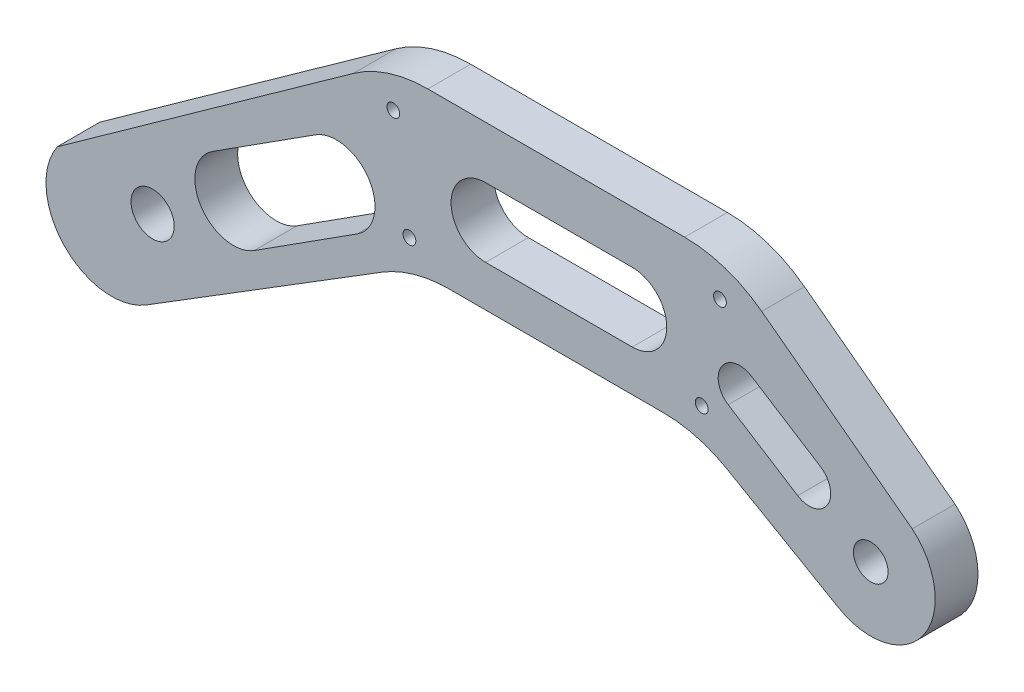
ISO-10303-21;
HEADER;
FILE_DESCRIPTION(('STEP AP214'),'2;1');
FILE_NAME('part.step','',(''),(''),'','','');
FILE_SCHEMA(('AUTOMOTIVE_DESIGN { 1 0 10303 214 1 1 1 1 }'));
ENDSEC;
DATA;
#1=APPLICATION_CONTEXT('core data for automotive mechanical design processes');
#2=APPLICATION_PROTOCOL_DEFINITION('international standard','automotive_design',2000,#1);
#3=PRODUCT_CONTEXT('',#1,'mechanical');
#4=PRODUCT('Part','Part','',(#3));
#5=PRODUCT_RELATED_PRODUCT_CATEGORY('part','',(#4));
#6=PRODUCT_DEFINITION_FORMATION('','',#4);
#7=PRODUCT_DEFINITION_CONTEXT('part definition',#1,'design');
#8=PRODUCT_DEFINITION('design','',#6,#7);
#9=PRODUCT_DEFINITION_SHAPE('','',#8);
#10=(LENGTH_UNIT() NAMED_UNIT(*) SI_UNIT(.MILLI.,.METRE.));
#11=(NAMED_UNIT(*) PLANE_ANGLE_UNIT() SI_UNIT($,.RADIAN.));
#12=(NAMED_UNIT(*) SI_UNIT($,.STERADIAN.) SOLID_ANGLE_UNIT());
#13=UNCERTAINTY_MEASURE_WITH_UNIT(LENGTH_MEASURE(1.E-05),#10,'distance_accuracy_value','');
#14=(GEOMETRIC_REPRESENTATION_CONTEXT(3) GLOBAL_UNCERTAINTY_ASSIGNED_CONTEXT((#13)) GLOBAL_UNIT_ASSIGNED_CONTEXT((#10,
#11,#12)) REPRESENTATION_CONTEXT('',''));
#15=CARTESIAN_POINT('',(0.,0.,0.));
#16=DIRECTION('',(0.,0.,1.));
#17=DIRECTION('',(1.,0.,0.));
#18=AXIS2_PLACEMENT_3D('',#15,#16,#17);
#19=CARTESIAN_POINT('',(66.9996322496604,-5.97090888332281,10.));
#20=DIRECTION('',(0.,0.,1.));
#21=DIRECTION('',(1.,0.,0.));
#22=AXIS2_PLACEMENT_3D('',#19,#20,#21);
#23=PLANE('',#22);
#24=DIRECTION('',(0.844639221607712,-0.535335955566146,0.));
#25=VECTOR('',#24,1.);
#26=CARTESIAN_POINT('',(33.6819304769976,9.18898153360824,10.));
#27=LINE('',#26,#25);
#28=CARTESIAN_POINT('',(33.6819304769976,9.18898153360824,10.));
#29=VERTEX_POINT('',#28);
#30=CARTESIAN_POINT('',(49.9150927269323,-1.09966621399208,10.));
#31=VERTEX_POINT('',#30);
#32=EDGE_CURVE('E202',#29,#31,#27,.T.);
#33=ORIENTED_EDGE('',*,*,#32,.F.);
#34=CARTESIAN_POINT('',(36.3754870818161,13.4388054626663,10.));
#35=DIRECTION('',(0.,0.,1.));
#36=DIRECTION('',(1.,0.,0.));
#37=AXIS2_PLACEMENT_3D('',#34,#35,#36);
#38=CIRCLE('',#37,5.03152567432146);
#39=CARTESIAN_POINT('',(39.0690436866346,17.6886293917244,10.));
#40=VERTEX_POINT('',#39);
#41=EDGE_CURVE('E194',#40,#29,#38,.T.);
#42=ORIENTED_EDGE('',*,*,#41,.F.);
#43=DIRECTION('',(-0.844639221607712,0.535335955566146,0.));
#44=VECTOR('',#43,1.);
#45=CARTESIAN_POINT('',(39.0690436866346,17.6886293917244,10.));
#46=LINE('',#45,#44);
#47=CARTESIAN_POINT('',(55.3022059365693,7.39998164412411,10.));
#48=VERTEX_POINT('',#47);
#49=EDGE_CURVE('E217',#48,#40,#46,.T.);
#50=ORIENTED_EDGE('',*,*,#49,.F.);
#51=CARTESIAN_POINT('',(52.6086493317508,3.15015771506601,10.));
#52=DIRECTION('',(0.,0.,1.));
#53=DIRECTION('',(1.,0.,0.));
#54=AXIS2_PLACEMENT_3D('',#51,#52,#53);
#55=CIRCLE('',#54,5.03152567432146);
#56=EDGE_CURVE('E215',#31,#48,#55,.T.);
#57=ORIENTED_EDGE('',*,*,#56,.F.);
#58=EDGE_LOOP('',(#33,#42,#50,#57));
#59=FACE_BOUND('',#58,.T.);
#60=DIRECTION('',(0.999999993836885,0.000111023552924919,0.));
#61=VECTOR('',#60,1.);
#62=CARTESIAN_POINT('',(-23.0148774643984,9.64579089430955,10.));
#63=LINE('',#62,#61);
#64=CARTESIAN_POINT('',(-23.0148774643984,9.64579089430955,10.));
#65=VERTEX_POINT('',#64);
#66=CARTESIAN_POINT('',(11.2525318644533,9.64959538386622,10.));
#67=VERTEX_POINT('',#66);
#68=EDGE_CURVE('E235',#65,#67,#63,.T.);
#69=ORIENTED_EDGE('',*,*,#68,.F.);
#70=CARTESIAN_POINT('',(-23.0157729525845,17.7115405214186,10.));
#71=DIRECTION('',(0.,0.,1.));
#72=DIRECTION('',(1.,0.,0.));
#73=AXIS2_PLACEMENT_3D('',#70,#71,#72);
#74=CIRCLE('',#73,8.06574967681922);
#75=CARTESIAN_POINT('',(-23.0166684407707,25.7772901485277,10.));
#76=VERTEX_POINT('',#75);
#77=EDGE_CURVE('E233',#76,#65,#74,.T.);
#78=ORIENTED_EDGE('',*,*,#77,.F.);
#79=DIRECTION('',(-0.999999993836885,-0.000111023552924919,0.));
#80=VECTOR('',#79,1.);
#81=CARTESIAN_POINT('',(-23.0166684407707,25.7772901485277,10.));
#82=LINE('',#81,#80);
#83=CARTESIAN_POINT('',(11.2507408880811,25.7810946380844,10.));
#84=VERTEX_POINT('',#83);
#85=EDGE_CURVE('E241',#84,#76,#82,.T.);
#86=ORIENTED_EDGE('',*,*,#85,.F.);
#87=CARTESIAN_POINT('',(11.2516363762672,17.7153450109753,10.));
#88=DIRECTION('',(0.,0.,1.));
#89=DIRECTION('',(1.,0.,0.));
#90=AXIS2_PLACEMENT_3D('',#87,#88,#89);
#91=CIRCLE('',#90,8.06574967681922);
#92=EDGE_CURVE('E238',#67,#84,#91,.T.);
#93=ORIENTED_EDGE('',*,*,#92,.F.);
#94=EDGE_LOOP('',(#69,#78,#86,#93));
#95=FACE_BOUND('',#94,.T.);
#96=CARTESIAN_POINT('',(27.4947716003729,5.86799341932424,10.));
#97=DIRECTION('',(0.,0.,1.));
#98=DIRECTION('',(1.,0.,0.));
#99=AXIS2_PLACEMENT_3D('',#96,#97,#98);
#100=CIRCLE('',#99,1.5);
#101=CARTESIAN_POINT('',(28.9947716003729,5.86799341932424,10.));
#102=VERTEX_POINT('',#101);
#103=EDGE_CURVE('E264',#102,#102,#100,.T.);
#104=ORIENTED_EDGE('',*,*,#103,.F.);
#105=EDGE_LOOP('',(#104));
#106=FACE_BOUND('',#105,.T.);
#107=CARTESIAN_POINT('',(-40.8181037870652,5.76558338358292,10.));
#108=DIRECTION('',(0.,0.,1.));
#109=DIRECTION('',(1.,0.,0.));
#110=AXIS2_PLACEMENT_3D('',#107,#108,#109);
#111=CIRCLE('',#110,1.49999999999998);
#112=CARTESIAN_POINT('',(-39.3181037870652,5.76558338358292,10.));
#113=VERTEX_POINT('',#112);
#114=EDGE_CURVE('E276',#113,#113,#111,.T.);
#115=ORIENTED_EDGE('',*,*,#114,.F.);
#116=EDGE_LOOP('',(#115));
#117=FACE_BOUND('',#116,.T.);
#118=CARTESIAN_POINT('',(66.9996322496604,-5.97090888332281,10.));
#119=DIRECTION('',(0.,0.,1.));
#120=DIRECTION('',(1.,0.,0.));
#121=AXIS2_PLACEMENT_3D('',#118,#119,#120);
#122=CIRCLE('',#121,4.05);
#123=CARTESIAN_POINT('',(71.0496322496604,-5.97090888332281,10.));
#124=VERTEX_POINT('',#123);
#125=EDGE_CURVE('E319',#124,#124,#122,.T.);
#126=ORIENTED_EDGE('',*,*,#125,.F.);
#127=EDGE_LOOP('',(#126));
#128=FACE_BOUND('',#127,.T.);
#129=CARTESIAN_POINT('',(66.9996322496604,-5.97090888332281,10.));
#130=DIRECTION('',(0.,0.,1.));
#131=DIRECTION('',(1.,0.,0.));
#132=AXIS2_PLACEMENT_3D('',#129,#130,#131);
#133=CIRCLE('',#132,15.0575187120752);
#134=CARTESIAN_POINT('',(59.4730599936473,-19.0123650842042,10.));
#135=VERTEX_POINT('',#134);
#136=CARTESIAN_POINT('',(76.6803530841787,5.56219624446554,10.));
#137=VERTEX_POINT('',#136);
#138=EDGE_CURVE('E325',#135,#137,#133,.T.);
#139=ORIENTED_EDGE('',*,*,#138,.T.);
#140=DIRECTION('',(-0.799474468914619,0.60070006954693,0.));
#141=VECTOR('',#140,1.);
#142=CARTESIAN_POINT('',(41.5151421460553,31.9842340674384,10.));
#143=LINE('',#142,#141);
#144=CARTESIAN_POINT('',(41.5151421460553,31.9842340674384,10.));
#145=VERTEX_POINT('',#144);
#146=EDGE_CURVE('E328',#137,#145,#143,.T.);
#147=ORIENTED_EDGE('',*,*,#146,.T.);
#148=CARTESIAN_POINT('',(23.4941400596474,7.9999999999998,10.));
#149=DIRECTION('',(0.,0.,1.));
#150=DIRECTION('',(1.,0.,0.));
#151=AXIS2_PLACEMENT_3D('',#148,#149,#150);
#152=CIRCLE('',#151,30.);
#153=CARTESIAN_POINT('',(23.4941400596474,37.9999999999998,10.));
#154=VERTEX_POINT('',#153);
#155=EDGE_CURVE('E331',#145,#154,#152,.T.);
#156=ORIENTED_EDGE('',*,*,#155,.T.);
#157=DIRECTION('',(-1.,0.,0.));
#158=VECTOR('',#157,1.);
#159=CARTESIAN_POINT('',(-36.5058599403526,37.9999999999999,10.));
#160=LINE('',#159,#158);
#161=CARTESIAN_POINT('',(-36.5058599403526,37.9999999999999,10.));
#162=VERTEX_POINT('',#161);
#163=EDGE_CURVE('E333',#154,#162,#160,.T.);
#164=ORIENTED_EDGE('',*,*,#163,.T.);
#165=CARTESIAN_POINT('',(-36.5058599403526,7.99999999999989,10.));
#166=DIRECTION('',(0.,0.,1.));
#167=DIRECTION('',(1.,0.,0.));
#168=AXIS2_PLACEMENT_3D('',#165,#166,#167);
#169=CIRCLE('',#168,30.);
#170=CARTESIAN_POINT('',(-53.9471297978905,32.4090578629437,10.));
#171=VERTEX_POINT('',#170);
#172=EDGE_CURVE('E335',#162,#171,#169,.T.);
#173=ORIENTED_EDGE('',*,*,#172,.T.);
#174=DIRECTION('',(-0.813635262098129,-0.581375661917929,0.));
#175=VECTOR('',#174,1.);
#176=CARTESIAN_POINT('',(-53.9471297978905,32.4090578629437,10.));
#177=LINE('',#176,#175);
#178=CARTESIAN_POINT('',(-123.106127076231,-17.0078734000802,10.));
#179=VERTEX_POINT('',#178);
#180=EDGE_CURVE('E337',#171,#179,#177,.T.);
#181=ORIENTED_EDGE('',*,*,#180,.T.);
#182=CARTESIAN_POINT('',(-110.402654210412,-25.6027206988543,10.));
#183=DIRECTION('',(0.,0.,1.));
#184=DIRECTION('',(-1.,0.,0.));
#185=AXIS2_PLACEMENT_3D('',#182,#183,#184);
#186=CIRCLE('',#185,15.3378493584286);
#187=CARTESIAN_POINT('',(-102.315148598159,-38.6350603166524,10.));
#188=VERTEX_POINT('',#187);
#189=EDGE_CURVE('E339',#179,#188,#186,.T.);
#190=ORIENTED_EDGE('',*,*,#189,.T.);
#191=DIRECTION('',(0.849684940388097,0.527290718747899,0.));
#192=VECTOR('',#191,1.);
#193=CARTESIAN_POINT('',(-47.3245815027895,-4.50945178835709,10.));
#194=LINE('',#193,#192);
#195=CARTESIAN_POINT('',(-47.3245815027895,-4.50945178835709,10.));
#196=VERTEX_POINT('',#195);
#197=EDGE_CURVE('E341',#188,#196,#194,.T.);
#198=ORIENTED_EDGE('',*,*,#197,.T.);
#199=CARTESIAN_POINT('',(-31.5058599403526,-30.,10.));
#200=DIRECTION('',(0.,0.,-1.));
#201=DIRECTION('',(1.,0.,0.));
#202=AXIS2_PLACEMENT_3D('',#199,#200,#201);
#203=CIRCLE('',#202,30.);
#204=CARTESIAN_POINT('',(-31.5058599403526,0.,10.));
#205=VERTEX_POINT('',#204);
#206=EDGE_CURVE('E343',#196,#205,#203,.T.);
#207=ORIENTED_EDGE('',*,*,#206,.T.);
#208=DIRECTION('',(1.,0.,0.));
#209=VECTOR('',#208,1.);
#210=CARTESIAN_POINT('',(-31.5058599403526,0.,10.));
#211=LINE('',#210,#209);
#212=CARTESIAN_POINT('',(18.4941400596474,-1.90488925126094E-13,10.));
#213=VERTEX_POINT('',#212);
#214=EDGE_CURVE('E345',#205,#213,#211,.T.);
#215=ORIENTED_EDGE('',*,*,#214,.T.);
#216=CARTESIAN_POINT('',(18.4941400596473,-30.0000000000002,10.));
#217=DIRECTION('',(0.,0.,-1.));
#218=DIRECTION('',(1.,0.,0.));
#219=AXIS2_PLACEMENT_3D('',#216,#217,#218);
#220=CIRCLE('',#219,30.);
#221=CARTESIAN_POINT('',(33.4897825687493,-4.01672257510221,10.));
#222=VERTEX_POINT('',#221);
#223=EDGE_CURVE('E347',#213,#222,#220,.T.);
#224=ORIENTED_EDGE('',*,*,#223,.T.);
#225=DIRECTION('',(0.866109247496599,-0.4998547503034,0.));
#226=VECTOR('',#225,1.);
#227=CARTESIAN_POINT('',(33.4897825687493,-4.01672257510221,10.));
#228=LINE('',#227,#226);
#229=EDGE_CURVE('E349',#222,#135,#228,.T.);
#230=ORIENTED_EDGE('',*,*,#229,.T.);
#231=EDGE_LOOP('',(#139,#147,#156,#164,#173,#181,#190,#198,#207,#215,#224,#230));
#232=FACE_BOUND('',#231,.T.);
#233=CARTESIAN_POINT('',(-44.5758143792834,29.6531275088075,10.));
#234=DIRECTION('',(0.,0.,1.));
#235=DIRECTION('',(1.,0.,0.));
#236=AXIS2_PLACEMENT_3D('',#233,#234,#235);
#237=CIRCLE('',#236,1.50000000000001);
#238=CARTESIAN_POINT('',(-43.0758143792834,29.6531275088075,10.));
#239=VERTEX_POINT('',#238);
#240=EDGE_CURVE('E313',#239,#239,#237,.T.);
#241=ORIENTED_EDGE('',*,*,#240,.F.);
#242=EDGE_LOOP('',(#241));
#243=FACE_BOUND('',#242,.T.);
#244=DIRECTION('',(0.842381925813462,0.538880961867094,0.));
#245=VECTOR('',#244,1.);
#246=CARTESIAN_POINT('',(-77.0725993824998,-14.9887164971939,10.));
#247=LINE('',#246,#245);
#248=CARTESIAN_POINT('',(-77.0725993824998,-14.9887164971939,10.));
#249=VERTEX_POINT('',#248);
#250=CARTESIAN_POINT('',(-53.0140360617953,0.401810467023691,10.));
#251=VERTEX_POINT('',#250);
#252=EDGE_CURVE('E284',#249,#251,#247,.T.);
#253=ORIENTED_EDGE('',*,*,#252,.F.);
#254=CARTESIAN_POINT('',(-81.9332446058939,-7.39052696421769,10.));
#255=DIRECTION('',(0.,0.,1.));
#256=DIRECTION('',(1.,0.,0.));
#257=AXIS2_PLACEMENT_3D('',#254,#255,#256);
#258=CIRCLE('',#257,9.01988670476146);
#259=CARTESIAN_POINT('',(-86.793889829288,0.207662568758501,10.));
#260=VERTEX_POINT('',#259);
#261=EDGE_CURVE('E282',#260,#249,#258,.T.);
#262=ORIENTED_EDGE('',*,*,#261,.F.);
#263=DIRECTION('',(-0.842381925813462,-0.538880961867094,0.));
#264=VECTOR('',#263,1.);
#265=CARTESIAN_POINT('',(-86.793889829288,0.207662568758501,10.));
#266=LINE('',#265,#264);
#267=CARTESIAN_POINT('',(-62.7353265085835,15.5981895329761,10.));
#268=VERTEX_POINT('',#267);
#269=EDGE_CURVE('E290',#268,#260,#266,.T.);
#270=ORIENTED_EDGE('',*,*,#269,.F.);
#271=CARTESIAN_POINT('',(-57.8746812851894,7.99999999999989,10.));
#272=DIRECTION('',(0.,0.,1.));
#273=DIRECTION('',(1.,0.,0.));
#274=AXIS2_PLACEMENT_3D('',#271,#272,#273);
#275=CIRCLE('',#274,9.01988670476146);
#276=EDGE_CURVE('E287',#251,#268,#275,.T.);
#277=ORIENTED_EDGE('',*,*,#276,.F.);
#278=EDGE_LOOP('',(#253,#262,#270,#277));
#279=FACE_BOUND('',#278,.T.);
#280=CARTESIAN_POINT('',(31.7549387550586,29.5667763227115,10.));
#281=DIRECTION('',(0.,0.,1.));
#282=DIRECTION('',(1.,0.,0.));
#283=AXIS2_PLACEMENT_3D('',#280,#281,#282);
#284=CIRCLE('',#283,1.5);
#285=CARTESIAN_POINT('',(33.2549387550586,29.5667763227115,10.));
#286=VERTEX_POINT('',#285);
#287=EDGE_CURVE('E270',#286,#286,#284,.T.);
#288=ORIENTED_EDGE('',*,*,#287,.F.);
#289=EDGE_LOOP('',(#288));
#290=FACE_BOUND('',#289,.T.);
#291=CARTESIAN_POINT('',(-100.821311964303,-19.4734309226343,10.));
#292=DIRECTION('',(0.,0.,1.));
#293=DIRECTION('',(1.,0.,0.));
#294=AXIS2_PLACEMENT_3D('',#291,#292,#293);
#295=CIRCLE('',#294,5.05);
#296=CARTESIAN_POINT('',(-95.7713119643031,-19.4734309226343,10.));
#297=VERTEX_POINT('',#296);
#298=EDGE_CURVE('E223',#297,#297,#295,.T.);
#299=ORIENTED_EDGE('',*,*,#298,.F.);
#300=EDGE_LOOP('',(#299));
#301=FACE_BOUND('',#300,.T.);
#302=ADVANCED_FACE('F33',(#59,#95,#106,#117,#128,#232,#243,#279,#290,#301),#23,.T.);
#303=CARTESIAN_POINT('',(66.9996322496604,-5.97090888332281,0.));
#304=DIRECTION('',(0.,0.,1.));
#305=DIRECTION('',(1.,0.,0.));
#306=AXIS2_PLACEMENT_3D('',#303,#304,#305);
#307=PLANE('',#306);
#308=CARTESIAN_POINT('',(-23.0157729525845,17.7115405214186,0.));
#309=DIRECTION('',(0.,0.,1.));
#310=DIRECTION('',(1.,0.,0.));
#311=AXIS2_PLACEMENT_3D('',#308,#309,#310);
#312=CIRCLE('',#311,8.06574967681922);
#313=CARTESIAN_POINT('',(-23.0166684407707,25.7772901485277,0.));
#314=VERTEX_POINT('',#313);
#315=CARTESIAN_POINT('',(-23.0148774643984,9.64579089430955,0.));
#316=VERTEX_POINT('',#315);
#317=EDGE_CURVE('E210',#314,#316,#312,.T.);
#318=ORIENTED_EDGE('',*,*,#317,.T.);
#319=DIRECTION('',(0.999999993836885,0.000111023552924919,0.));
#320=VECTOR('',#319,1.);
#321=CARTESIAN_POINT('',(-23.0148774643984,9.64579089430955,0.));
#322=LINE('',#321,#320);
#323=CARTESIAN_POINT('',(11.2525318644533,9.64959538386622,0.));
#324=VERTEX_POINT('',#323);
#325=EDGE_CURVE('E246',#316,#324,#322,.T.);
#326=ORIENTED_EDGE('',*,*,#325,.T.);
#327=CARTESIAN_POINT('',(11.2516363762672,17.7153450109753,0.));
#328=DIRECTION('',(0.,0.,1.));
#329=DIRECTION('',(1.,0.,0.));
#330=AXIS2_PLACEMENT_3D('',#327,#328,#329);
#331=CIRCLE('',#330,8.06574967681922);
#332=CARTESIAN_POINT('',(11.2507408880811,25.7810946380844,0.));
#333=VERTEX_POINT('',#332);
#334=EDGE_CURVE('E249',#324,#333,#331,.T.);
#335=ORIENTED_EDGE('',*,*,#334,.T.);
#336=DIRECTION('',(-0.999999993836885,-0.000111023552924919,0.));
#337=VECTOR('',#336,1.);
#338=CARTESIAN_POINT('',(-23.0166684407707,25.7772901485277,0.));
#339=LINE('',#338,#337);
#340=EDGE_CURVE('E236',#333,#314,#339,.T.);
#341=ORIENTED_EDGE('',*,*,#340,.T.);
#342=EDGE_LOOP('',(#318,#326,#335,#341));
#343=FACE_BOUND('',#342,.T.);
#344=CARTESIAN_POINT('',(-44.5758143792834,29.6531275088075,0.));
#345=DIRECTION('',(0.,0.,1.));
#346=DIRECTION('',(1.,0.,0.));
#347=AXIS2_PLACEMENT_3D('',#344,#345,#346);
#348=CIRCLE('',#347,1.50000000000001);
#349=CARTESIAN_POINT('',(-43.0758143792834,29.6531275088075,0.));
#350=VERTEX_POINT('',#349);
#351=EDGE_CURVE('E312',#350,#350,#348,.T.);
#352=ORIENTED_EDGE('',*,*,#351,.T.);
#353=EDGE_LOOP('',(#352));
#354=FACE_BOUND('',#353,.T.);
#355=CARTESIAN_POINT('',(66.9996322496604,-5.97090888332281,0.));
#356=DIRECTION('',(0.,0.,1.));
#357=DIRECTION('',(1.,0.,0.));
#358=AXIS2_PLACEMENT_3D('',#355,#356,#357);
#359=CIRCLE('',#358,4.05);
#360=CARTESIAN_POINT('',(71.0496322496604,-5.97090888332281,0.));
#361=VERTEX_POINT('',#360);
#362=EDGE_CURVE('E316',#361,#361,#359,.T.);
#363=ORIENTED_EDGE('',*,*,#362,.T.);
#364=EDGE_LOOP('',(#363));
#365=FACE_BOUND('',#364,.T.);
#366=CARTESIAN_POINT('',(66.9996322496604,-5.97090888332281,0.));
#367=DIRECTION('',(0.,0.,1.));
#368=DIRECTION('',(1.,0.,0.));
#369=AXIS2_PLACEMENT_3D('',#366,#367,#368);
#370=CIRCLE('',#369,15.0575187120752);
#371=CARTESIAN_POINT('',(59.4730599936473,-19.0123650842042,0.));
#372=VERTEX_POINT('',#371);
#373=CARTESIAN_POINT('',(76.6803530841787,5.56219624446554,0.));
#374=VERTEX_POINT('',#373);
#375=EDGE_CURVE('E322',#372,#374,#370,.T.);
#376=ORIENTED_EDGE('',*,*,#375,.F.);
#377=DIRECTION('',(0.866109247496599,-0.4998547503034,0.));
#378=VECTOR('',#377,1.);
#379=CARTESIAN_POINT('',(33.4897825687493,-4.01672257510221,0.));
#380=LINE('',#379,#378);
#381=CARTESIAN_POINT('',(33.4897825687493,-4.01672257510221,0.));
#382=VERTEX_POINT('',#381);
#383=EDGE_CURVE('E329',#382,#372,#380,.T.);
#384=ORIENTED_EDGE('',*,*,#383,.F.);
#385=CARTESIAN_POINT('',(18.4941400596473,-30.0000000000002,0.));
#386=DIRECTION('',(0.,0.,-1.));
#387=DIRECTION('',(1.,0.,0.));
#388=AXIS2_PLACEMENT_3D('',#385,#386,#387);
#389=CIRCLE('',#388,30.);
#390=CARTESIAN_POINT('',(18.4941400596474,-1.90488925126094E-13,0.));
#391=VERTEX_POINT('',#390);
#392=EDGE_CURVE('E372',#391,#382,#389,.T.);
#393=ORIENTED_EDGE('',*,*,#392,.F.);
#394=DIRECTION('',(1.,0.,0.));
#395=VECTOR('',#394,1.);
#396=CARTESIAN_POINT('',(-31.5058599403526,0.,0.));
#397=LINE('',#396,#395);
#398=CARTESIAN_POINT('',(-31.5058599403526,0.,0.));
#399=VERTEX_POINT('',#398);
#400=EDGE_CURVE('E370',#399,#391,#397,.T.);
#401=ORIENTED_EDGE('',*,*,#400,.F.);
#402=CARTESIAN_POINT('',(-31.5058599403526,-30.,0.));
#403=DIRECTION('',(0.,0.,-1.));
#404=DIRECTION('',(1.,0.,0.));
#405=AXIS2_PLACEMENT_3D('',#402,#403,#404);
#406=CIRCLE('',#405,30.);
#407=CARTESIAN_POINT('',(-47.3245815027895,-4.50945178835709,0.));
#408=VERTEX_POINT('',#407);
#409=EDGE_CURVE('E368',#408,#399,#406,.T.);
#410=ORIENTED_EDGE('',*,*,#409,.F.);
#411=DIRECTION('',(0.849684940388097,0.527290718747899,0.));
#412=VECTOR('',#411,1.);
#413=CARTESIAN_POINT('',(-47.3245815027895,-4.50945178835709,0.));
#414=LINE('',#413,#412);
#415=CARTESIAN_POINT('',(-102.315148598159,-38.6350603166524,0.));
#416=VERTEX_POINT('',#415);
#417=EDGE_CURVE('E366',#416,#408,#414,.T.);
#418=ORIENTED_EDGE('',*,*,#417,.F.);
#419=CARTESIAN_POINT('',(-110.402654210412,-25.6027206988543,0.));
#420=DIRECTION('',(0.,0.,1.));
#421=DIRECTION('',(-1.,0.,0.));
#422=AXIS2_PLACEMENT_3D('',#419,#420,#421);
#423=CIRCLE('',#422,15.3378493584286);
#424=CARTESIAN_POINT('',(-123.106127076231,-17.0078734000802,0.));
#425=VERTEX_POINT('',#424);
#426=EDGE_CURVE('E364',#425,#416,#423,.T.);
#427=ORIENTED_EDGE('',*,*,#426,.F.);
#428=DIRECTION('',(-0.813635262098129,-0.581375661917929,0.));
#429=VECTOR('',#428,1.);
#430=CARTESIAN_POINT('',(-53.9471297978905,32.4090578629437,0.));
#431=LINE('',#430,#429);
#432=CARTESIAN_POINT('',(-53.9471297978905,32.4090578629437,0.));
#433=VERTEX_POINT('',#432);
#434=EDGE_CURVE('E362',#433,#425,#431,.T.);
#435=ORIENTED_EDGE('',*,*,#434,.F.);
#436=CARTESIAN_POINT('',(-36.5058599403526,7.99999999999989,0.));
#437=DIRECTION('',(0.,0.,1.));
#438=DIRECTION('',(1.,0.,0.));
#439=AXIS2_PLACEMENT_3D('',#436,#437,#438);
#440=CIRCLE('',#439,30.);
#441=CARTESIAN_POINT('',(-36.5058599403526,37.9999999999999,0.));
#442=VERTEX_POINT('',#441);
#443=EDGE_CURVE('E360',#442,#433,#440,.T.);
#444=ORIENTED_EDGE('',*,*,#443,.F.);
#445=DIRECTION('',(-1.,0.,0.));
#446=VECTOR('',#445,1.);
#447=CARTESIAN_POINT('',(-36.5058599403526,37.9999999999999,0.));
#448=LINE('',#447,#446);
#449=CARTESIAN_POINT('',(23.4941400596474,37.9999999999998,0.));
#450=VERTEX_POINT('',#449);
#451=EDGE_CURVE('E358',#450,#442,#448,.T.);
#452=ORIENTED_EDGE('',*,*,#451,.F.);
#453=CARTESIAN_POINT('',(23.4941400596474,7.9999999999998,0.));
#454=DIRECTION('',(0.,0.,1.));
#455=DIRECTION('',(1.,0.,0.));
#456=AXIS2_PLACEMENT_3D('',#453,#454,#455);
#457=CIRCLE('',#456,30.);
#458=CARTESIAN_POINT('',(41.5151421460553,31.9842340674384,0.));
#459=VERTEX_POINT('',#458);
#460=EDGE_CURVE('E356',#459,#450,#457,.T.);
#461=ORIENTED_EDGE('',*,*,#460,.F.);
#462=DIRECTION('',(-0.799474468914619,0.60070006954693,0.));
#463=VECTOR('',#462,1.);
#464=CARTESIAN_POINT('',(41.5151421460553,31.9842340674384,0.));
#465=LINE('',#464,#463);
#466=EDGE_CURVE('E354',#374,#459,#465,.T.);
#467=ORIENTED_EDGE('',*,*,#466,.F.);
#468=EDGE_LOOP('',(#376,#384,#393,#401,#410,#418,#427,#435,#444,#452,#461,#467));
#469=FACE_BOUND('',#468,.T.);
#470=CARTESIAN_POINT('',(-81.9332446058939,-7.39052696421769,0.));
#471=DIRECTION('',(0.,0.,1.));
#472=DIRECTION('',(1.,0.,0.));
#473=AXIS2_PLACEMENT_3D('',#470,#471,#472);
#474=CIRCLE('',#473,9.01988670476146);
#475=CARTESIAN_POINT('',(-86.793889829288,0.207662568758496,0.));
#476=VERTEX_POINT('',#475);
#477=CARTESIAN_POINT('',(-77.0725993824998,-14.9887164971939,0.));
#478=VERTEX_POINT('',#477);
#479=EDGE_CURVE('E279',#476,#478,#474,.T.);
#480=ORIENTED_EDGE('',*,*,#479,.T.);
#481=DIRECTION('',(0.842381925813462,0.538880961867094,0.));
#482=VECTOR('',#481,1.);
#483=CARTESIAN_POINT('',(-77.0725993824998,-14.9887164971939,0.));
#484=LINE('',#483,#482);
#485=CARTESIAN_POINT('',(-53.0140360617953,0.401810467023691,0.));
#486=VERTEX_POINT('',#485);
#487=EDGE_CURVE('E295',#478,#486,#484,.T.);
#488=ORIENTED_EDGE('',*,*,#487,.T.);
#489=CARTESIAN_POINT('',(-57.8746812851894,7.99999999999989,0.));
#490=DIRECTION('',(0.,0.,1.));
#491=DIRECTION('',(1.,0.,0.));
#492=AXIS2_PLACEMENT_3D('',#489,#490,#491);
#493=CIRCLE('',#492,9.01988670476146);
#494=CARTESIAN_POINT('',(-62.7353265085835,15.5981895329761,0.));
#495=VERTEX_POINT('',#494);
#496=EDGE_CURVE('E298',#486,#495,#493,.T.);
#497=ORIENTED_EDGE('',*,*,#496,.T.);
#498=DIRECTION('',(-0.842381925813462,-0.538880961867094,0.));
#499=VECTOR('',#498,1.);
#500=CARTESIAN_POINT('',(-86.793889829288,0.207662568758501,0.));
#501=LINE('',#500,#499);
#502=EDGE_CURVE('E285',#495,#476,#501,.T.);
#503=ORIENTED_EDGE('',*,*,#502,.T.);
#504=EDGE_LOOP('',(#480,#488,#497,#503));
#505=FACE_BOUND('',#504,.T.);
#506=CARTESIAN_POINT('',(-40.8181037870652,5.76558338358292,0.));
#507=DIRECTION('',(0.,0.,1.));
#508=DIRECTION('',(1.,0.,0.));
#509=AXIS2_PLACEMENT_3D('',#506,#507,#508);
#510=CIRCLE('',#509,1.49999999999998);
#511=CARTESIAN_POINT('',(-39.3181037870652,5.76558338358292,0.));
#512=VERTEX_POINT('',#511);
#513=EDGE_CURVE('E273',#512,#512,#510,.T.);
#514=ORIENTED_EDGE('',*,*,#513,.T.);
#515=EDGE_LOOP('',(#514));
#516=FACE_BOUND('',#515,.T.);
#517=CARTESIAN_POINT('',(31.7549387550586,29.5667763227115,0.));
#518=DIRECTION('',(0.,0.,1.));
#519=DIRECTION('',(1.,0.,0.));
#520=AXIS2_PLACEMENT_3D('',#517,#518,#519);
#521=CIRCLE('',#520,1.5);
#522=CARTESIAN_POINT('',(33.2549387550586,29.5667763227115,0.));
#523=VERTEX_POINT('',#522);
#524=EDGE_CURVE('E267',#523,#523,#521,.T.);
#525=ORIENTED_EDGE('',*,*,#524,.T.);
#526=EDGE_LOOP('',(#525));
#527=FACE_BOUND('',#526,.T.);
#528=CARTESIAN_POINT('',(27.4947716003729,5.86799341932424,0.));
#529=DIRECTION('',(0.,0.,1.));
#530=DIRECTION('',(1.,0.,0.));
#531=AXIS2_PLACEMENT_3D('',#528,#529,#530);
#532=CIRCLE('',#531,1.5);
#533=CARTESIAN_POINT('',(28.9947716003729,5.86799341932424,0.));
#534=VERTEX_POINT('',#533);
#535=EDGE_CURVE('E263',#534,#534,#532,.T.);
#536=ORIENTED_EDGE('',*,*,#535,.T.);
#537=EDGE_LOOP('',(#536));
#538=FACE_BOUND('',#537,.T.);
#539=CARTESIAN_POINT('',(36.3754870818161,13.4388054626663,0.));
#540=DIRECTION('',(0.,0.,1.));
#541=DIRECTION('',(1.,0.,0.));
#542=AXIS2_PLACEMENT_3D('',#539,#540,#541);
#543=CIRCLE('',#542,5.03152567432146);
#544=CARTESIAN_POINT('',(39.0690436866346,17.6886293917244,0.));
#545=VERTEX_POINT('',#544);
#546=CARTESIAN_POINT('',(33.6819304769976,9.18898153360824,0.));
#547=VERTEX_POINT('',#546);
#548=EDGE_CURVE('E56',#545,#547,#543,.T.);
#549=ORIENTED_EDGE('',*,*,#548,.T.);
#550=DIRECTION('',(0.844639221607712,-0.535335955566146,0.));
#551=VECTOR('',#550,1.);
#552=CARTESIAN_POINT('',(33.6819304769976,9.18898153360824,0.));
#553=LINE('',#552,#551);
#554=CARTESIAN_POINT('',(49.9150927269323,-1.09966621399208,0.));
#555=VERTEX_POINT('',#554);
#556=EDGE_CURVE('E209',#547,#555,#553,.T.);
#557=ORIENTED_EDGE('',*,*,#556,.T.);
#558=CARTESIAN_POINT('',(52.6086493317508,3.15015771506601,0.));
#559=DIRECTION('',(0.,0.,1.));
#560=DIRECTION('',(1.,0.,0.));
#561=AXIS2_PLACEMENT_3D('',#558,#559,#560);
#562=CIRCLE('',#561,5.03152567432146);
#563=CARTESIAN_POINT('',(55.3022059365693,7.3999816441241,0.));
#564=VERTEX_POINT('',#563);
#565=EDGE_CURVE('E225',#555,#564,#562,.T.);
#566=ORIENTED_EDGE('',*,*,#565,.T.);
#567=DIRECTION('',(-0.844639221607712,0.535335955566146,0.));
#568=VECTOR('',#567,1.);
#569=CARTESIAN_POINT('',(39.0690436866346,17.6886293917244,0.));
#570=LINE('',#569,#568);
#571=EDGE_CURVE('E203',#564,#545,#570,.T.);
#572=ORIENTED_EDGE('',*,*,#571,.T.);
#573=EDGE_LOOP('',(#549,#557,#566,#572));
#574=FACE_BOUND('',#573,.T.);
#575=CARTESIAN_POINT('',(-100.821311964303,-19.4734309226343,0.));
#576=DIRECTION('',(0.,0.,1.));
#577=DIRECTION('',(1.,0.,0.));
#578=AXIS2_PLACEMENT_3D('',#575,#576,#577);
#579=CIRCLE('',#578,5.05);
#580=CARTESIAN_POINT('',(-95.7713119643031,-19.4734309226343,0.));
#581=VERTEX_POINT('',#580);
#582=EDGE_CURVE('E757',#581,#581,#579,.T.);
#583=ORIENTED_EDGE('',*,*,#582,.T.);
#584=EDGE_LOOP('',(#583));
#585=FACE_BOUND('',#584,.T.);
#586=ADVANCED_FACE('F414',(#343,#354,#365,#469,#505,#516,#527,#538,#574,#585),#307,.F.);
#587=CARTESIAN_POINT('',(66.9996322496604,-5.97090888332281,10.));
#588=DIRECTION('',(0.,0.,-1.));
#589=DIRECTION('',(-1.,0.,0.));
#590=AXIS2_PLACEMENT_3D('',#587,#588,#589);
#591=CYLINDRICAL_SURFACE('',#590,15.0575187120752);
#592=ORIENTED_EDGE('',*,*,#375,.T.);
#593=DIRECTION('',(0.,0.,-1.));
#594=VECTOR('',#593,1.);
#595=CARTESIAN_POINT('',(76.6803530841787,5.56219624446554,10.));
#596=LINE('',#595,#594);
#597=EDGE_CURVE('E11',#137,#374,#596,.T.);
#598=ORIENTED_EDGE('',*,*,#597,.F.);
#599=ORIENTED_EDGE('',*,*,#138,.F.);
#600=DIRECTION('',(0.,0.,-1.));
#601=VECTOR('',#600,1.);
#602=CARTESIAN_POINT('',(59.4730599936473,-19.0123650842042,10.));
#603=LINE('',#602,#601);
#604=EDGE_CURVE('E351',#135,#372,#603,.T.);
#605=ORIENTED_EDGE('',*,*,#604,.T.);
#606=EDGE_LOOP('',(#592,#598,#599,#605));
#607=FACE_BOUND('',#606,.T.);
#608=ADVANCED_FACE('F35',(#607),#591,.T.);
#609=CARTESIAN_POINT('',(41.5151421460553,31.9842340674384,10.));
#610=DIRECTION('',(-0.60070006954693,-0.79947446891462,0.));
#611=DIRECTION('',(0.79947446891462,-0.60070006954693,0.));
#612=AXIS2_PLACEMENT_3D('',#609,#610,#611);
#613=PLANE('',#612);
#614=ORIENTED_EDGE('',*,*,#466,.T.);
#615=DIRECTION('',(0.,0.,-1.));
#616=VECTOR('',#615,1.);
#617=CARTESIAN_POINT('',(41.5151421460553,31.9842340674384,10.));
#618=LINE('',#617,#616);
#619=EDGE_CURVE('E41',#145,#459,#618,.T.);
#620=ORIENTED_EDGE('',*,*,#619,.F.);
#621=ORIENTED_EDGE('',*,*,#146,.F.);
#622=ORIENTED_EDGE('',*,*,#597,.T.);
#623=EDGE_LOOP('',(#614,#620,#621,#622));
#624=FACE_BOUND('',#623,.T.);
#625=ADVANCED_FACE('F432',(#624),#613,.F.);
#626=CARTESIAN_POINT('',(23.4941400596474,7.9999999999998,10.));
#627=DIRECTION('',(0.,0.,-1.));
#628=DIRECTION('',(-1.,0.,0.));
#629=AXIS2_PLACEMENT_3D('',#626,#627,#628);
#630=CYLINDRICAL_SURFACE('',#629,30.);
#631=ORIENTED_EDGE('',*,*,#460,.T.);
#632=DIRECTION('',(0.,0.,-1.));
#633=VECTOR('',#632,1.);
#634=CARTESIAN_POINT('',(23.4941400596474,37.9999999999998,10.));
#635=LINE('',#634,#633);
#636=EDGE_CURVE('E401',#154,#450,#635,.T.);
#637=ORIENTED_EDGE('',*,*,#636,.F.);
#638=ORIENTED_EDGE('',*,*,#155,.F.);
#639=ORIENTED_EDGE('',*,*,#619,.T.);
#640=EDGE_LOOP('',(#631,#637,#638,#639));
#641=FACE_BOUND('',#640,.T.);
#642=ADVANCED_FACE('F408',(#641),#630,.T.);
#643=CARTESIAN_POINT('',(-36.5058599403526,37.9999999999999,10.));
#644=DIRECTION('',(0.,-1.,0.));
#645=DIRECTION('',(1.,0.,0.));
#646=AXIS2_PLACEMENT_3D('',#643,#644,#645);
#647=PLANE('',#646);
#648=ORIENTED_EDGE('',*,*,#451,.T.);
#649=DIRECTION('',(0.,0.,-1.));
#650=VECTOR('',#649,1.);
#651=CARTESIAN_POINT('',(-36.5058599403526,37.9999999999999,10.));
#652=LINE('',#651,#650);
#653=EDGE_CURVE('E398',#162,#442,#652,.T.);
#654=ORIENTED_EDGE('',*,*,#653,.F.);
#655=ORIENTED_EDGE('',*,*,#163,.F.);
#656=ORIENTED_EDGE('',*,*,#636,.T.);
#657=EDGE_LOOP('',(#648,#654,#655,#656));
#658=FACE_BOUND('',#657,.T.);
#659=ADVANCED_FACE('F420',(#658),#647,.F.);
#660=CARTESIAN_POINT('',(-36.5058599403526,7.99999999999989,10.));
#661=DIRECTION('',(0.,0.,-1.));
#662=DIRECTION('',(-1.,0.,0.));
#663=AXIS2_PLACEMENT_3D('',#660,#661,#662);
#664=CYLINDRICAL_SURFACE('',#663,30.);
#665=ORIENTED_EDGE('',*,*,#443,.T.);
#666=DIRECTION('',(0.,0.,-1.));
#667=VECTOR('',#666,1.);
#668=CARTESIAN_POINT('',(-53.9471297978905,32.4090578629437,10.));
#669=LINE('',#668,#667);
#670=EDGE_CURVE('E395',#171,#433,#669,.T.);
#671=ORIENTED_EDGE('',*,*,#670,.F.);
#672=ORIENTED_EDGE('',*,*,#172,.F.);
#673=ORIENTED_EDGE('',*,*,#653,.T.);
#674=EDGE_LOOP('',(#665,#671,#672,#673));
#675=FACE_BOUND('',#674,.T.);
#676=ADVANCED_FACE('F424',(#675),#664,.T.);
#677=CARTESIAN_POINT('',(-53.9471297978905,32.4090578629437,10.));
#678=DIRECTION('',(0.581375661917929,-0.813635262098129,0.));
#679=DIRECTION('',(0.813635262098129,0.581375661917929,0.));
#680=AXIS2_PLACEMENT_3D('',#677,#678,#679);
#681=PLANE('',#680);
#682=ORIENTED_EDGE('',*,*,#434,.T.);
#683=DIRECTION('',(0.,0.,-1.));
#684=VECTOR('',#683,1.);
#685=CARTESIAN_POINT('',(-123.106127076231,-17.0078734000802,10.));
#686=LINE('',#685,#684);
#687=EDGE_CURVE('E392',#179,#425,#686,.T.);
#688=ORIENTED_EDGE('',*,*,#687,.F.);
#689=ORIENTED_EDGE('',*,*,#180,.F.);
#690=ORIENTED_EDGE('',*,*,#670,.T.);
#691=EDGE_LOOP('',(#682,#688,#689,#690));
#692=FACE_BOUND('',#691,.T.);
#693=ADVANCED_FACE('F465',(#692),#681,.F.);
#694=CARTESIAN_POINT('',(-110.402654210412,-25.6027206988543,10.));
#695=DIRECTION('',(0.,0.,-1.));
#696=DIRECTION('',(-1.,0.,0.));
#697=AXIS2_PLACEMENT_3D('',#694,#695,#696);
#698=CYLINDRICAL_SURFACE('',#697,15.3378493584286);
#699=ORIENTED_EDGE('',*,*,#426,.T.);
#700=DIRECTION('',(0.,0.,-1.));
#701=VECTOR('',#700,1.);
#702=CARTESIAN_POINT('',(-102.315148598159,-38.6350603166524,10.));
#703=LINE('',#702,#701);
#704=EDGE_CURVE('E389',#188,#416,#703,.T.);
#705=ORIENTED_EDGE('',*,*,#704,.F.);
#706=ORIENTED_EDGE('',*,*,#189,.F.);
#707=ORIENTED_EDGE('',*,*,#687,.T.);
#708=EDGE_LOOP('',(#699,#705,#706,#707));
#709=FACE_BOUND('',#708,.T.);
#710=ADVANCED_FACE('F463',(#709),#698,.T.);
#711=CARTESIAN_POINT('',(-47.3245815027895,-4.50945178835709,10.));
#712=DIRECTION('',(-0.527290718747899,0.849684940388097,0.));
#713=DIRECTION('',(-0.849684940388097,-0.527290718747899,0.));
#714=AXIS2_PLACEMENT_3D('',#711,#712,#713);
#715=PLANE('',#714);
#716=ORIENTED_EDGE('',*,*,#417,.T.);
#717=DIRECTION('',(0.,0.,-1.));
#718=VECTOR('',#717,1.);
#719=CARTESIAN_POINT('',(-47.3245815027895,-4.50945178835709,10.));
#720=LINE('',#719,#718);
#721=EDGE_CURVE('E386',#196,#408,#720,.T.);
#722=ORIENTED_EDGE('',*,*,#721,.F.);
#723=ORIENTED_EDGE('',*,*,#197,.F.);
#724=ORIENTED_EDGE('',*,*,#704,.T.);
#725=EDGE_LOOP('',(#716,#722,#723,#724));
#726=FACE_BOUND('',#725,.T.);
#727=ADVANCED_FACE('F459',(#726),#715,.F.);
#728=CARTESIAN_POINT('',(-31.5058599403526,-30.,10.));
#729=DIRECTION('',(0.,0.,-1.));
#730=DIRECTION('',(-1.,0.,0.));
#731=AXIS2_PLACEMENT_3D('',#728,#729,#730);
#732=CYLINDRICAL_SURFACE('',#731,30.);
#733=ORIENTED_EDGE('',*,*,#409,.T.);
#734=DIRECTION('',(0.,0.,-1.));
#735=VECTOR('',#734,1.);
#736=CARTESIAN_POINT('',(-31.5058599403526,0.,10.));
#737=LINE('',#736,#735);
#738=EDGE_CURVE('E383',#205,#399,#737,.T.);
#739=ORIENTED_EDGE('',*,*,#738,.F.);
#740=ORIENTED_EDGE('',*,*,#206,.F.);
#741=ORIENTED_EDGE('',*,*,#721,.T.);
#742=EDGE_LOOP('',(#733,#739,#740,#741));
#743=FACE_BOUND('',#742,.T.);
#744=ADVANCED_FACE('F454',(#743),#732,.F.);
#745=CARTESIAN_POINT('',(-31.5058599403526,0.,10.));
#746=DIRECTION('',(0.,1.,0.));
#747=DIRECTION('',(-1.,0.,0.));
#748=AXIS2_PLACEMENT_3D('',#745,#746,#747);
#749=PLANE('',#748);
#750=ORIENTED_EDGE('',*,*,#400,.T.);
#751=DIRECTION('',(0.,0.,-1.));
#752=VECTOR('',#751,1.);
#753=CARTESIAN_POINT('',(18.4941400596474,-1.90488925126094E-13,10.));
#754=LINE('',#753,#752);
#755=EDGE_CURVE('E380',#213,#391,#754,.T.);
#756=ORIENTED_EDGE('',*,*,#755,.F.);
#757=ORIENTED_EDGE('',*,*,#214,.F.);
#758=ORIENTED_EDGE('',*,*,#738,.T.);
#759=EDGE_LOOP('',(#750,#756,#757,#758));
#760=FACE_BOUND('',#759,.T.);
#761=ADVANCED_FACE('F448',(#760),#749,.F.);
#762=CARTESIAN_POINT('',(18.4941400596473,-30.0000000000002,10.));
#763=DIRECTION('',(0.,0.,-1.));
#764=DIRECTION('',(-1.,0.,0.));
#765=AXIS2_PLACEMENT_3D('',#762,#763,#764);
#766=CYLINDRICAL_SURFACE('',#765,30.);
#767=ORIENTED_EDGE('',*,*,#392,.T.);
#768=DIRECTION('',(0.,0.,-1.));
#769=VECTOR('',#768,1.);
#770=CARTESIAN_POINT('',(33.4897825687493,-4.01672257510221,10.));
#771=LINE('',#770,#769);
#772=EDGE_CURVE('E377',#222,#382,#771,.T.);
#773=ORIENTED_EDGE('',*,*,#772,.F.);
#774=ORIENTED_EDGE('',*,*,#223,.F.);
#775=ORIENTED_EDGE('',*,*,#755,.T.);
#776=EDGE_LOOP('',(#767,#773,#774,#775));
#777=FACE_BOUND('',#776,.T.);
#778=ADVANCED_FACE('F444',(#777),#766,.F.);
#779=CARTESIAN_POINT('',(33.4897825687493,-4.01672257510221,10.));
#780=DIRECTION('',(0.4998547503034,0.866109247496599,0.));
#781=DIRECTION('',(-0.866109247496599,0.4998547503034,0.));
#782=AXIS2_PLACEMENT_3D('',#779,#780,#781);
#783=PLANE('',#782);
#784=ORIENTED_EDGE('',*,*,#383,.T.);
#785=ORIENTED_EDGE('',*,*,#604,.F.);
#786=ORIENTED_EDGE('',*,*,#229,.F.);
#787=ORIENTED_EDGE('',*,*,#772,.T.);
#788=EDGE_LOOP('',(#784,#785,#786,#787));
#789=FACE_BOUND('',#788,.T.);
#790=ADVANCED_FACE('F439',(#789),#783,.F.);
#791=CARTESIAN_POINT('',(66.9996322496604,-5.97090888332281,10.));
#792=DIRECTION('',(0.,0.,-1.));
#793=DIRECTION('',(-1.,0.,0.));
#794=AXIS2_PLACEMENT_3D('',#791,#792,#793);
#795=CYLINDRICAL_SURFACE('',#794,4.05);
#796=ORIENTED_EDGE('',*,*,#125,.T.);
#797=EDGE_LOOP('',(#796));
#798=FACE_BOUND('',#797,.T.);
#799=ORIENTED_EDGE('',*,*,#362,.F.);
#800=EDGE_LOOP('',(#799));
#801=FACE_BOUND('',#800,.T.);
#802=ADVANCED_FACE('F482',(#798,#801),#795,.F.);
#803=CARTESIAN_POINT('',(-44.5758143792834,29.6531275088075,10.));
#804=DIRECTION('',(0.,0.,-1.));
#805=DIRECTION('',(-1.,0.,0.));
#806=AXIS2_PLACEMENT_3D('',#803,#804,#805);
#807=CYLINDRICAL_SURFACE('',#806,1.50000000000001);
#808=ORIENTED_EDGE('',*,*,#240,.T.);
#809=EDGE_LOOP('',(#808));
#810=FACE_BOUND('',#809,.T.);
#811=ORIENTED_EDGE('',*,*,#351,.F.);
#812=EDGE_LOOP('',(#811));
#813=FACE_BOUND('',#812,.T.);
#814=ADVANCED_FACE('F520',(#810,#813),#807,.F.);
#815=CARTESIAN_POINT('',(-81.9332446058939,-7.39052696421769,10.));
#816=DIRECTION('',(0.,0.,-1.));
#817=DIRECTION('',(-1.,0.,0.));
#818=AXIS2_PLACEMENT_3D('',#815,#816,#817);
#819=CYLINDRICAL_SURFACE('',#818,9.01988670476146);
#820=ORIENTED_EDGE('',*,*,#479,.F.);
#821=DIRECTION('',(0.,0.,-1.));
#822=VECTOR('',#821,1.);
#823=CARTESIAN_POINT('',(-86.793889829288,0.207662568758501,10.));
#824=LINE('',#823,#822);
#825=EDGE_CURVE('E292',#260,#476,#824,.T.);
#826=ORIENTED_EDGE('',*,*,#825,.F.);
#827=ORIENTED_EDGE('',*,*,#261,.T.);
#828=DIRECTION('',(0.,0.,-1.));
#829=VECTOR('',#828,1.);
#830=CARTESIAN_POINT('',(-77.0725993824998,-14.9887164971939,10.));
#831=LINE('',#830,#829);
#832=EDGE_CURVE('E309',#249,#478,#831,.T.);
#833=ORIENTED_EDGE('',*,*,#832,.T.);
#834=EDGE_LOOP('',(#820,#826,#827,#833));
#835=FACE_BOUND('',#834,.T.);
#836=ADVANCED_FACE('F527',(#835),#819,.F.);
#837=CARTESIAN_POINT('',(-77.0725993824998,-14.9887164971939,10.));
#838=DIRECTION('',(-0.538880961867093,0.842381925813462,0.));
#839=DIRECTION('',(-0.842381925813462,-0.538880961867093,0.));
#840=AXIS2_PLACEMENT_3D('',#837,#838,#839);
#841=PLANE('',#840);
#842=ORIENTED_EDGE('',*,*,#487,.F.);
#843=ORIENTED_EDGE('',*,*,#832,.F.);
#844=ORIENTED_EDGE('',*,*,#252,.T.);
#845=DIRECTION('',(0.,0.,-1.));
#846=VECTOR('',#845,1.);
#847=CARTESIAN_POINT('',(-53.0140360617953,0.401810467023691,10.));
#848=LINE('',#847,#846);
#849=EDGE_CURVE('E307',#251,#486,#848,.T.);
#850=ORIENTED_EDGE('',*,*,#849,.T.);
#851=EDGE_LOOP('',(#842,#843,#844,#850));
#852=FACE_BOUND('',#851,.T.);
#853=ADVANCED_FACE('F534',(#852),#841,.T.);
#854=CARTESIAN_POINT('',(-57.8746812851894,7.99999999999989,10.));
#855=DIRECTION('',(0.,0.,-1.));
#856=DIRECTION('',(-1.,0.,0.));
#857=AXIS2_PLACEMENT_3D('',#854,#855,#856);
#858=CYLINDRICAL_SURFACE('',#857,9.01988670476146);
#859=ORIENTED_EDGE('',*,*,#496,.F.);
#860=ORIENTED_EDGE('',*,*,#849,.F.);
#861=ORIENTED_EDGE('',*,*,#276,.T.);
#862=DIRECTION('',(0.,0.,-1.));
#863=VECTOR('',#862,1.);
#864=CARTESIAN_POINT('',(-62.7353265085835,15.5981895329761,10.));
#865=LINE('',#864,#863);
#866=EDGE_CURVE('E305',#268,#495,#865,.T.);
#867=ORIENTED_EDGE('',*,*,#866,.T.);
#868=EDGE_LOOP('',(#859,#860,#861,#867));
#869=FACE_BOUND('',#868,.T.);
#870=ADVANCED_FACE('F542',(#869),#858,.F.);
#871=CARTESIAN_POINT('',(-86.793889829288,0.207662568758501,10.));
#872=DIRECTION('',(0.538880961867093,-0.842381925813462,0.));
#873=DIRECTION('',(0.842381925813462,0.538880961867093,0.));
#874=AXIS2_PLACEMENT_3D('',#871,#872,#873);
#875=PLANE('',#874);
#876=ORIENTED_EDGE('',*,*,#502,.F.);
#877=ORIENTED_EDGE('',*,*,#866,.F.);
#878=ORIENTED_EDGE('',*,*,#269,.T.);
#879=ORIENTED_EDGE('',*,*,#825,.T.);
#880=EDGE_LOOP('',(#876,#877,#878,#879));
#881=FACE_BOUND('',#880,.T.);
#882=ADVANCED_FACE('F550',(#881),#875,.T.);
#883=CARTESIAN_POINT('',(-40.8181037870652,5.76558338358292,10.));
#884=DIRECTION('',(0.,0.,-1.));
#885=DIRECTION('',(-1.,0.,0.));
#886=AXIS2_PLACEMENT_3D('',#883,#884,#885);
#887=CYLINDRICAL_SURFACE('',#886,1.49999999999998);
#888=ORIENTED_EDGE('',*,*,#114,.T.);
#889=EDGE_LOOP('',(#888));
#890=FACE_BOUND('',#889,.T.);
#891=ORIENTED_EDGE('',*,*,#513,.F.);
#892=EDGE_LOOP('',(#891));
#893=FACE_BOUND('',#892,.T.);
#894=ADVANCED_FACE('F558',(#890,#893),#887,.F.);
#895=CARTESIAN_POINT('',(31.7549387550586,29.5667763227115,10.));
#896=DIRECTION('',(0.,0.,-1.));
#897=DIRECTION('',(-1.,0.,0.));
#898=AXIS2_PLACEMENT_3D('',#895,#896,#897);
#899=CYLINDRICAL_SURFACE('',#898,1.5);
#900=ORIENTED_EDGE('',*,*,#287,.T.);
#901=EDGE_LOOP('',(#900));
#902=FACE_BOUND('',#901,.T.);
#903=ORIENTED_EDGE('',*,*,#524,.F.);
#904=EDGE_LOOP('',(#903));
#905=FACE_BOUND('',#904,.T.);
#906=ADVANCED_FACE('F566',(#902,#905),#899,.F.);
#907=CARTESIAN_POINT('',(27.4947716003729,5.86799341932424,10.));
#908=DIRECTION('',(0.,0.,-1.));
#909=DIRECTION('',(-1.,0.,0.));
#910=AXIS2_PLACEMENT_3D('',#907,#908,#909);
#911=CYLINDRICAL_SURFACE('',#910,1.5);
#912=ORIENTED_EDGE('',*,*,#103,.T.);
#913=EDGE_LOOP('',(#912));
#914=FACE_BOUND('',#913,.T.);
#915=ORIENTED_EDGE('',*,*,#535,.F.);
#916=EDGE_LOOP('',(#915));
#917=FACE_BOUND('',#916,.T.);
#918=ADVANCED_FACE('F574',(#914,#917),#911,.F.);
#919=CARTESIAN_POINT('',(-23.0157729525845,17.7115405214186,10.));
#920=DIRECTION('',(0.,0.,-1.));
#921=DIRECTION('',(-1.,0.,0.));
#922=AXIS2_PLACEMENT_3D('',#919,#920,#921);
#923=CYLINDRICAL_SURFACE('',#922,8.06574967681922);
#924=ORIENTED_EDGE('',*,*,#317,.F.);
#925=DIRECTION('',(0.,0.,-1.));
#926=VECTOR('',#925,1.);
#927=CARTESIAN_POINT('',(-23.0166684407707,25.7772901485277,10.));
#928=LINE('',#927,#926);
#929=EDGE_CURVE('E243',#76,#314,#928,.T.);
#930=ORIENTED_EDGE('',*,*,#929,.F.);
#931=ORIENTED_EDGE('',*,*,#77,.T.);
#932=DIRECTION('',(0.,0.,-1.));
#933=VECTOR('',#932,1.);
#934=CARTESIAN_POINT('',(-23.0148774643984,9.64579089430955,10.));
#935=LINE('',#934,#933);
#936=EDGE_CURVE('E260',#65,#316,#935,.T.);
#937=ORIENTED_EDGE('',*,*,#936,.T.);
#938=EDGE_LOOP('',(#924,#930,#931,#937));
#939=FACE_BOUND('',#938,.T.);
#940=ADVANCED_FACE('F582',(#939),#923,.F.);
#941=CARTESIAN_POINT('',(-23.0148774643984,9.64579089430955,10.));
#942=DIRECTION('',(-0.000111023552924919,0.999999993836885,0.));
#943=DIRECTION('',(-0.999999993836885,-0.000111023552924919,0.));
#944=AXIS2_PLACEMENT_3D('',#941,#942,#943);
#945=PLANE('',#944);
#946=ORIENTED_EDGE('',*,*,#325,.F.);
#947=ORIENTED_EDGE('',*,*,#936,.F.);
#948=ORIENTED_EDGE('',*,*,#68,.T.);
#949=DIRECTION('',(0.,0.,-1.));
#950=VECTOR('',#949,1.);
#951=CARTESIAN_POINT('',(11.2525318644533,9.64959538386622,10.));
#952=LINE('',#951,#950);
#953=EDGE_CURVE('E258',#67,#324,#952,.T.);
#954=ORIENTED_EDGE('',*,*,#953,.T.);
#955=EDGE_LOOP('',(#946,#947,#948,#954));
#956=FACE_BOUND('',#955,.T.);
#957=ADVANCED_FACE('F590',(#956),#945,.T.);
#958=CARTESIAN_POINT('',(11.2516363762672,17.7153450109753,10.));
#959=DIRECTION('',(0.,0.,-1.));
#960=DIRECTION('',(-1.,0.,0.));
#961=AXIS2_PLACEMENT_3D('',#958,#959,#960);
#962=CYLINDRICAL_SURFACE('',#961,8.06574967681922);
#963=ORIENTED_EDGE('',*,*,#334,.F.);
#964=ORIENTED_EDGE('',*,*,#953,.F.);
#965=ORIENTED_EDGE('',*,*,#92,.T.);
#966=DIRECTION('',(0.,0.,-1.));
#967=VECTOR('',#966,1.);
#968=CARTESIAN_POINT('',(11.2507408880811,25.7810946380844,10.));
#969=LINE('',#968,#967);
#970=EDGE_CURVE('E256',#84,#333,#969,.T.);
#971=ORIENTED_EDGE('',*,*,#970,.T.);
#972=EDGE_LOOP('',(#963,#964,#965,#971));
#973=FACE_BOUND('',#972,.T.);
#974=ADVANCED_FACE('F598',(#973),#962,.F.);
#975=CARTESIAN_POINT('',(-23.0166684407707,25.7772901485277,10.));
#976=DIRECTION('',(0.000111023552924919,-0.999999993836885,0.));
#977=DIRECTION('',(0.999999993836885,0.000111023552924919,0.));
#978=AXIS2_PLACEMENT_3D('',#975,#976,#977);
#979=PLANE('',#978);
#980=ORIENTED_EDGE('',*,*,#340,.F.);
#981=ORIENTED_EDGE('',*,*,#970,.F.);
#982=ORIENTED_EDGE('',*,*,#85,.T.);
#983=ORIENTED_EDGE('',*,*,#929,.T.);
#984=EDGE_LOOP('',(#980,#981,#982,#983));
#985=FACE_BOUND('',#984,.T.);
#986=ADVANCED_FACE('F606',(#985),#979,.T.);
#987=CARTESIAN_POINT('',(36.3754870818161,13.4388054626663,10.));
#988=DIRECTION('',(0.,0.,-1.));
#989=DIRECTION('',(-1.,0.,0.));
#990=AXIS2_PLACEMENT_3D('',#987,#988,#989);
#991=CYLINDRICAL_SURFACE('',#990,5.03152567432146);
#992=ORIENTED_EDGE('',*,*,#548,.F.);
#993=DIRECTION('',(0.,0.,-1.));
#994=VECTOR('',#993,1.);
#995=CARTESIAN_POINT('',(39.0690436866346,17.6886293917244,10.));
#996=LINE('',#995,#994);
#997=EDGE_CURVE('E198',#40,#545,#996,.T.);
#998=ORIENTED_EDGE('',*,*,#997,.F.);
#999=ORIENTED_EDGE('',*,*,#41,.T.);
#1000=DIRECTION('',(0.,0.,-1.));
#1001=VECTOR('',#1000,1.);
#1002=CARTESIAN_POINT('',(33.6819304769976,9.18898153360824,10.));
#1003=LINE('',#1002,#1001);
#1004=EDGE_CURVE('E197',#29,#547,#1003,.T.);
#1005=ORIENTED_EDGE('',*,*,#1004,.T.);
#1006=EDGE_LOOP('',(#992,#998,#999,#1005));
#1007=FACE_BOUND('',#1006,.T.);
#1008=ADVANCED_FACE('F196',(#1007),#991,.F.);
#1009=CARTESIAN_POINT('',(33.6819304769976,9.18898153360824,10.));
#1010=DIRECTION('',(0.535335955566146,0.844639221607712,0.));
#1011=DIRECTION('',(-0.844639221607712,0.535335955566146,0.));
#1012=AXIS2_PLACEMENT_3D('',#1009,#1010,#1011);
#1013=PLANE('',#1012);
#1014=ORIENTED_EDGE('',*,*,#556,.F.);
#1015=ORIENTED_EDGE('',*,*,#1004,.F.);
#1016=ORIENTED_EDGE('',*,*,#32,.T.);
#1017=DIRECTION('',(0.,0.,-1.));
#1018=VECTOR('',#1017,1.);
#1019=CARTESIAN_POINT('',(49.9150927269323,-1.09966621399208,10.));
#1020=LINE('',#1019,#1018);
#1021=EDGE_CURVE('E211',#31,#555,#1020,.T.);
#1022=ORIENTED_EDGE('',*,*,#1021,.T.);
#1023=EDGE_LOOP('',(#1014,#1015,#1016,#1022));
#1024=FACE_BOUND('',#1023,.T.);
#1025=ADVANCED_FACE('F206',(#1024),#1013,.T.);
#1026=CARTESIAN_POINT('',(52.6086493317508,3.15015771506601,10.));
#1027=DIRECTION('',(0.,0.,-1.));
#1028=DIRECTION('',(-1.,0.,0.));
#1029=AXIS2_PLACEMENT_3D('',#1026,#1027,#1028);
#1030=CYLINDRICAL_SURFACE('',#1029,5.03152567432146);
#1031=ORIENTED_EDGE('',*,*,#565,.F.);
#1032=ORIENTED_EDGE('',*,*,#1021,.F.);
#1033=ORIENTED_EDGE('',*,*,#56,.T.);
#1034=DIRECTION('',(0.,0.,-1.));
#1035=VECTOR('',#1034,1.);
#1036=CARTESIAN_POINT('',(55.3022059365693,7.3999816441241,10.));
#1037=LINE('',#1036,#1035);
#1038=EDGE_CURVE('E48',#48,#564,#1037,.T.);
#1039=ORIENTED_EDGE('',*,*,#1038,.T.);
#1040=EDGE_LOOP('',(#1031,#1032,#1033,#1039));
#1041=FACE_BOUND('',#1040,.T.);
#1042=ADVANCED_FACE('F627',(#1041),#1030,.F.);
#1043=CARTESIAN_POINT('',(39.0690436866346,17.6886293917244,10.));
#1044=DIRECTION('',(-0.535335955566146,-0.844639221607712,0.));
#1045=DIRECTION('',(0.844639221607712,-0.535335955566146,0.));
#1046=AXIS2_PLACEMENT_3D('',#1043,#1044,#1045);
#1047=PLANE('',#1046);
#1048=ORIENTED_EDGE('',*,*,#571,.F.);
#1049=ORIENTED_EDGE('',*,*,#1038,.F.);
#1050=ORIENTED_EDGE('',*,*,#49,.T.);
#1051=ORIENTED_EDGE('',*,*,#997,.T.);
#1052=EDGE_LOOP('',(#1048,#1049,#1050,#1051));
#1053=FACE_BOUND('',#1052,.T.);
#1054=ADVANCED_FACE('F634',(#1053),#1047,.T.);
#1055=CARTESIAN_POINT('',(-100.821311964303,-19.4734309226343,10.));
#1056=DIRECTION('',(0.,0.,-1.));
#1057=DIRECTION('',(-1.,0.,0.));
#1058=AXIS2_PLACEMENT_3D('',#1055,#1056,#1057);
#1059=CYLINDRICAL_SURFACE('',#1058,5.05);
#1060=ORIENTED_EDGE('',*,*,#298,.T.);
#1061=EDGE_LOOP('',(#1060));
#1062=FACE_BOUND('',#1061,.T.);
#1063=ORIENTED_EDGE('',*,*,#582,.F.);
#1064=EDGE_LOOP('',(#1063));
#1065=FACE_BOUND('',#1064,.T.);
#1066=ADVANCED_FACE('F642',(#1062,#1065),#1059,.F.);
#1067=CLOSED_SHELL('',(#302,#586,#608,#625,#642,#659,#676,#693,#710,#727,#744,#761,#778,#790,
#802,#814,#836,#853,#870,#882,#894,#906,#918,#940,#957,#974,#986,#1008,#1025,#1042,#1054,#1066));
#1068=MANIFOLD_SOLID_BREP('B2',#1067);
#1069=ADVANCED_BREP_SHAPE_REPRESENTATION('',(#18,#1068),#14);
#1070=SHAPE_DEFINITION_REPRESENTATION(#9,#1069);
ENDSEC;
END-ISO-10303-21;
